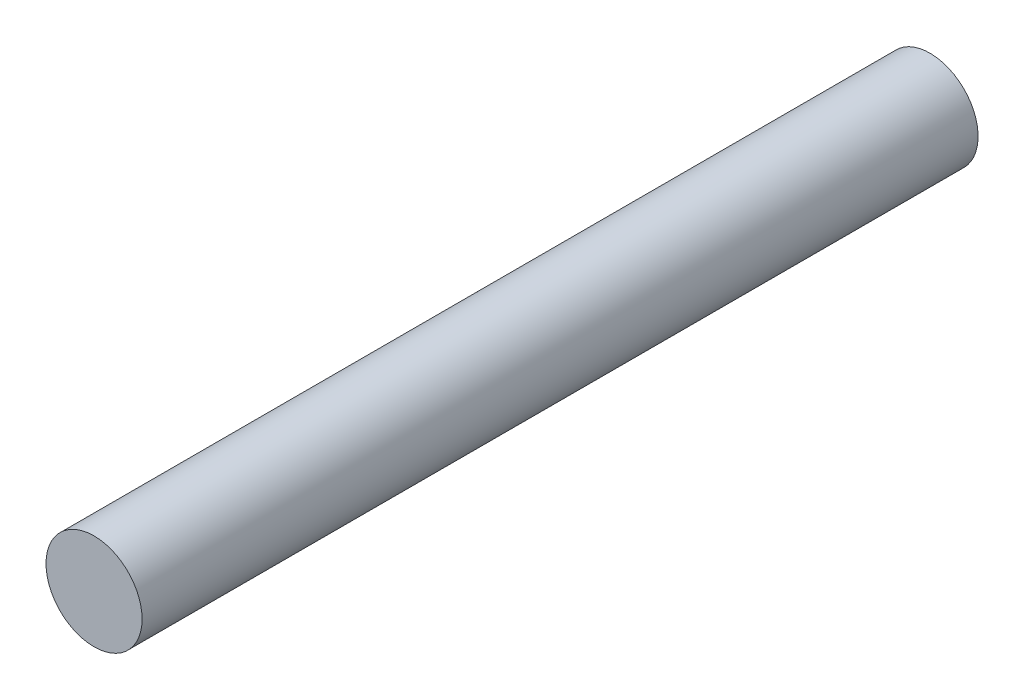
ISO-10303-21;
HEADER;
FILE_DESCRIPTION(('STEP AP214'),'2;1');
FILE_NAME('part.step','',(''),(''),'','','');
FILE_SCHEMA(('AUTOMOTIVE_DESIGN { 1 0 10303 214 1 1 1 1 }'));
ENDSEC;
DATA;
#1=APPLICATION_CONTEXT('core data for automotive mechanical design processes');
#2=APPLICATION_PROTOCOL_DEFINITION('international standard','automotive_design',2000,#1);
#3=PRODUCT_CONTEXT('',#1,'mechanical');
#4=PRODUCT('Part','Part','',(#3));
#5=PRODUCT_RELATED_PRODUCT_CATEGORY('part','',(#4));
#6=PRODUCT_DEFINITION_FORMATION('','',#4);
#7=PRODUCT_DEFINITION_CONTEXT('part definition',#1,'design');
#8=PRODUCT_DEFINITION('design','',#6,#7);
#9=PRODUCT_DEFINITION_SHAPE('','',#8);
#10=(LENGTH_UNIT() NAMED_UNIT(*) SI_UNIT(.MILLI.,.METRE.));
#11=(NAMED_UNIT(*) PLANE_ANGLE_UNIT() SI_UNIT($,.RADIAN.));
#12=(NAMED_UNIT(*) SI_UNIT($,.STERADIAN.) SOLID_ANGLE_UNIT());
#13=UNCERTAINTY_MEASURE_WITH_UNIT(LENGTH_MEASURE(1.E-05),#10,'distance_accuracy_value','');
#14=(GEOMETRIC_REPRESENTATION_CONTEXT(3) GLOBAL_UNCERTAINTY_ASSIGNED_CONTEXT((#13)) GLOBAL_UNIT_ASSIGNED_CONTEXT((#10,
#11,#12)) REPRESENTATION_CONTEXT('',''));
#15=CARTESIAN_POINT('',(0.,0.,0.));
#16=DIRECTION('',(0.,0.,1.));
#17=DIRECTION('',(1.,0.,0.));
#18=AXIS2_PLACEMENT_3D('',#15,#16,#17);
#19=CARTESIAN_POINT('',(0.,0.,50.));
#20=DIRECTION('',(0.,0.,-1.));
#21=DIRECTION('',(-1.,0.,0.));
#22=AXIS2_PLACEMENT_3D('',#19,#20,#21);
#23=CYLINDRICAL_SURFACE('',#22,3.);
#24=CARTESIAN_POINT('',(0.,0.,22.35));
#25=DIRECTION('',(0.,0.,1.));
#26=DIRECTION('',(1.,0.,0.));
#27=AXIS2_PLACEMENT_3D('',#24,#25,#26);
#28=CIRCLE('',#27,3.);
#29=CARTESIAN_POINT('',(3.,0.,22.35));
#30=VERTEX_POINT('',#29);
#31=EDGE_CURVE('E11',#30,#30,#28,.F.);
#32=ORIENTED_EDGE('',*,*,#31,.T.);
#33=EDGE_LOOP('',(#32));
#34=FACE_BOUND('',#33,.T.);
#35=CARTESIAN_POINT('',(0.,0.,-29.85));
#36=DIRECTION('',(0.,0.,-1.));
#37=DIRECTION('',(-1.,0.,0.));
#38=AXIS2_PLACEMENT_3D('',#35,#36,#37);
#39=CIRCLE('',#38,3.);
#40=CARTESIAN_POINT('',(-3.,0.,-29.85));
#41=VERTEX_POINT('',#40);
#42=EDGE_CURVE('E37',#41,#41,#39,.F.);
#43=ORIENTED_EDGE('',*,*,#42,.T.);
#44=EDGE_LOOP('',(#43));
#45=FACE_BOUND('',#44,.T.);
#46=ADVANCED_FACE('F31',(#34,#45),#23,.T.);
#47=CARTESIAN_POINT('',(0.,0.,22.35));
#48=DIRECTION('',(0.,0.,1.));
#49=DIRECTION('',(1.,0.,0.));
#50=AXIS2_PLACEMENT_3D('',#47,#48,#49);
#51=PLANE('',#50);
#52=ORIENTED_EDGE('',*,*,#31,.F.);
#53=EDGE_LOOP('',(#52));
#54=FACE_BOUND('',#53,.T.);
#55=ADVANCED_FACE('F46',(#54),#51,.T.);
#56=CARTESIAN_POINT('',(0.,0.,-29.85));
#57=DIRECTION('',(0.,0.,-1.));
#58=DIRECTION('',(-1.,0.,0.));
#59=AXIS2_PLACEMENT_3D('',#56,#57,#58);
#60=PLANE('',#59);
#61=ORIENTED_EDGE('',*,*,#42,.F.);
#62=EDGE_LOOP('',(#61));
#63=FACE_BOUND('',#62,.T.);
#64=ADVANCED_FACE('F44',(#63),#60,.T.);
#65=CLOSED_SHELL('',(#46,#55,#64));
#66=MANIFOLD_SOLID_BREP('B2',#65);
#67=ADVANCED_BREP_SHAPE_REPRESENTATION('',(#18,#66),#14);
#68=SHAPE_DEFINITION_REPRESENTATION(#9,#67);
ENDSEC;
END-ISO-10303-21;
